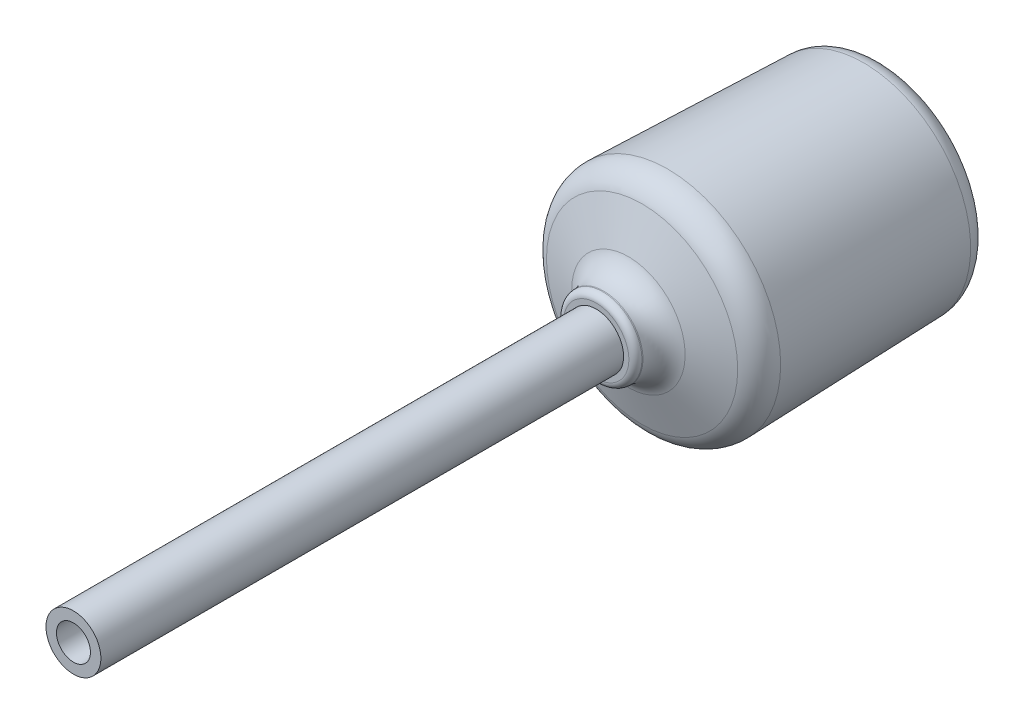
ISO-10303-21;
HEADER;
FILE_DESCRIPTION(('STEP AP214'),'2;1');
FILE_NAME('part.step','',(''),(''),'','','');
FILE_SCHEMA(('AUTOMOTIVE_DESIGN { 1 0 10303 214 1 1 1 1 }'));
ENDSEC;
DATA;
#1=APPLICATION_CONTEXT('core data for automotive mechanical design processes');
#2=APPLICATION_PROTOCOL_DEFINITION('international standard','automotive_design',2000,#1);
#3=PRODUCT_CONTEXT('',#1,'mechanical');
#4=PRODUCT('Part','Part','',(#3));
#5=PRODUCT_RELATED_PRODUCT_CATEGORY('part','',(#4));
#6=PRODUCT_DEFINITION_FORMATION('','',#4);
#7=PRODUCT_DEFINITION_CONTEXT('part definition',#1,'design');
#8=PRODUCT_DEFINITION('design','',#6,#7);
#9=PRODUCT_DEFINITION_SHAPE('','',#8);
#10=(LENGTH_UNIT() NAMED_UNIT(*) SI_UNIT(.MILLI.,.METRE.));
#11=(NAMED_UNIT(*) PLANE_ANGLE_UNIT() SI_UNIT($,.RADIAN.));
#12=(NAMED_UNIT(*) SI_UNIT($,.STERADIAN.) SOLID_ANGLE_UNIT());
#13=UNCERTAINTY_MEASURE_WITH_UNIT(LENGTH_MEASURE(1.E-05),#10,'distance_accuracy_value','');
#14=(GEOMETRIC_REPRESENTATION_CONTEXT(3) GLOBAL_UNCERTAINTY_ASSIGNED_CONTEXT((#13)) GLOBAL_UNIT_ASSIGNED_CONTEXT((#10,
#11,#12)) REPRESENTATION_CONTEXT('',''));
#15=CARTESIAN_POINT('',(0.,0.,0.));
#16=DIRECTION('',(0.,0.,1.));
#17=DIRECTION('',(1.,0.,0.));
#18=AXIS2_PLACEMENT_3D('',#15,#16,#17);
#19=CARTESIAN_POINT('',(0.,0.,-60.4292669602345));
#20=DIRECTION('',(0.,0.,1.));
#21=DIRECTION('',(1.,0.,0.));
#22=AXIS2_PLACEMENT_3D('',#19,#20,#21);
#23=TOROIDAL_SURFACE('',#22,6.68291096583191,1.49999999999997);
#24=CARTESIAN_POINT('',(0.,0.,-60.4763865090254));
#25=DIRECTION('',(0.,0.,1.));
#26=DIRECTION('',(1.,0.,0.));
#27=AXIS2_PLACEMENT_3D('',#24,#25,#26);
#28=CIRCLE('',#27,8.18217069920757);
#29=CARTESIAN_POINT('',(-8.18217069920757,0.,-60.4763865090254));
#30=VERTEX_POINT('',#29);
#31=EDGE_CURVE('E115',#30,#30,#28,.T.);
#32=ORIENTED_EDGE('',*,*,#31,.F.);
#33=CARTESIAN_POINT('',(-6.68291096583191,0.,-60.4292669602345));
#34=DIRECTION('',(0.,-1.,0.));
#35=DIRECTION('',(-1.,0.,0.));
#36=AXIS2_PLACEMENT_3D('',#33,#34,#35);
#37=CIRCLE('',#36,1.49999999999997);
#38=CARTESIAN_POINT('',(-7.15154004131193,0.,-61.8541833751918));
#39=VERTEX_POINT('',#38);
#40=EDGE_CURVE('E10',#30,#39,#37,.T.);
#41=ORIENTED_EDGE('',*,*,#40,.T.);
#42=CARTESIAN_POINT('',(0.,0.,-61.8541833751918));
#43=DIRECTION('',(0.,0.,1.));
#44=DIRECTION('',(1.,0.,0.));
#45=AXIS2_PLACEMENT_3D('',#42,#43,#44);
#46=CIRCLE('',#45,7.15154004131193);
#47=EDGE_CURVE('E129',#39,#39,#46,.T.);
#48=ORIENTED_EDGE('',*,*,#47,.T.);
#49=ORIENTED_EDGE('',*,*,#40,.F.);
#50=EDGE_LOOP('',(#32,#41,#48,#49));
#51=FACE_BOUND('',#50,.T.);
#52=ADVANCED_FACE('F15',(#51),#23,.T.);
#53=CARTESIAN_POINT('',(0.,0.,-40.1091672627132));
#54=DIRECTION('',(0.,0.,1.));
#55=DIRECTION('',(1.,0.,0.));
#56=AXIS2_PLACEMENT_3D('',#53,#54,#55);
#57=SPHERICAL_SURFACE('',#56,22.8908333333333);
#58=ORIENTED_EDGE('',*,*,#47,.F.);
#59=CARTESIAN_POINT('',(0.,0.,-40.1091672627132));
#60=DIRECTION('',(0.,-1.,0.));
#61=DIRECTION('',(-1.,0.,0.));
#62=AXIS2_PLACEMENT_3D('',#59,#60,#61);
#63=CIRCLE('',#62,22.8908333333333);
#64=CARTESIAN_POINT('',(0.,0.,-63.0000005960465));
#65=VERTEX_POINT('',#64);
#66=EDGE_CURVE('E26',#39,#65,#63,.T.);
#67=ORIENTED_EDGE('',*,*,#66,.T.);
#68=ORIENTED_EDGE('',*,*,#66,.F.);
#69=EDGE_LOOP('',(#58,#67,#68));
#70=FACE_BOUND('',#69,.T.);
#71=ADVANCED_FACE('F176',(#70),#57,.T.);
#72=CARTESIAN_POINT('',(0.,0.,-10.0000001490116));
#73=DIRECTION('',(0.,0.,1.));
#74=DIRECTION('',(1.,0.,0.));
#75=AXIS2_PLACEMENT_3D('',#72,#73,#74);
#76=PLANE('',#75);
#77=CARTESIAN_POINT('',(0.,0.,-10.0000001490116));
#78=DIRECTION('',(0.,0.,1.));
#79=DIRECTION('',(1.,0.,0.));
#80=AXIS2_PLACEMENT_3D('',#77,#78,#79);
#81=CIRCLE('',#80,1.3);
#82=CARTESIAN_POINT('',(-1.3,0.,-10.0000001490116));
#83=VERTEX_POINT('',#82);
#84=EDGE_CURVE('E144',#83,#83,#81,.T.);
#85=ORIENTED_EDGE('',*,*,#84,.T.);
#86=EDGE_LOOP('',(#85));
#87=FACE_BOUND('',#86,.T.);
#88=ADVANCED_FACE('F178',(#87),#76,.T.);
#89=CARTESIAN_POINT('',(0.,0.,-5.00000007450581));
#90=DIRECTION('',(0.,0.,1.));
#91=DIRECTION('',(1.,0.,0.));
#92=AXIS2_PLACEMENT_3D('',#89,#90,#91);
#93=CYLINDRICAL_SURFACE('',#92,1.3);
#94=CARTESIAN_POINT('',(0.,0.,0.));
#95=DIRECTION('',(0.,0.,1.));
#96=DIRECTION('',(1.,0.,0.));
#97=AXIS2_PLACEMENT_3D('',#94,#95,#96);
#98=CIRCLE('',#97,1.3);
#99=CARTESIAN_POINT('',(-1.3,0.,0.));
#100=VERTEX_POINT('',#99);
#101=EDGE_CURVE('E138',#100,#100,#98,.T.);
#102=ORIENTED_EDGE('',*,*,#101,.T.);
#103=DIRECTION('',(0.,0.,-1.));
#104=VECTOR('',#103,1.);
#105=CARTESIAN_POINT('',(-1.3,0.,-5.00000007450581));
#106=LINE('',#105,#104);
#107=EDGE_CURVE('E141',#100,#83,#106,.T.);
#108=ORIENTED_EDGE('',*,*,#107,.T.);
#109=ORIENTED_EDGE('',*,*,#84,.F.);
#110=ORIENTED_EDGE('',*,*,#107,.F.);
#111=EDGE_LOOP('',(#102,#108,#109,#110));
#112=FACE_BOUND('',#111,.T.);
#113=ADVANCED_FACE('F17',(#112),#93,.F.);
#114=CARTESIAN_POINT('',(1.3,0.,0.));
#115=DIRECTION('',(0.,0.,1.));
#116=DIRECTION('',(1.,0.,0.));
#117=AXIS2_PLACEMENT_3D('',#114,#115,#116);
#118=PLANE('',#117);
#119=ORIENTED_EDGE('',*,*,#101,.F.);
#120=EDGE_LOOP('',(#119));
#121=FACE_BOUND('',#120,.T.);
#122=CARTESIAN_POINT('',(0.,0.,0.));
#123=DIRECTION('',(0.,0.,1.));
#124=DIRECTION('',(1.,0.,0.));
#125=AXIS2_PLACEMENT_3D('',#122,#123,#124);
#126=CIRCLE('',#125,2.1);
#127=CARTESIAN_POINT('',(-2.1,0.,0.));
#128=VERTEX_POINT('',#127);
#129=EDGE_CURVE('E133',#128,#128,#126,.T.);
#130=ORIENTED_EDGE('',*,*,#129,.T.);
#131=EDGE_LOOP('',(#130));
#132=FACE_BOUND('',#131,.T.);
#133=ADVANCED_FACE('F188',(#121,#132),#118,.T.);
#134=CARTESIAN_POINT('',(0.,0.,-20.));
#135=DIRECTION('',(0.,0.,1.));
#136=DIRECTION('',(1.,0.,0.));
#137=AXIS2_PLACEMENT_3D('',#134,#135,#136);
#138=CYLINDRICAL_SURFACE('',#137,2.1);
#139=ORIENTED_EDGE('',*,*,#129,.F.);
#140=DIRECTION('',(0.,0.,-1.));
#141=VECTOR('',#140,1.);
#142=CARTESIAN_POINT('',(-2.1,0.,-20.));
#143=LINE('',#142,#141);
#144=CARTESIAN_POINT('',(-2.1,0.,-40.));
#145=VERTEX_POINT('',#144);
#146=EDGE_CURVE('E135',#128,#145,#143,.T.);
#147=ORIENTED_EDGE('',*,*,#146,.T.);
#148=CARTESIAN_POINT('',(0.,0.,-40.));
#149=DIRECTION('',(0.,0.,1.));
#150=DIRECTION('',(1.,0.,0.));
#151=AXIS2_PLACEMENT_3D('',#148,#149,#150);
#152=CIRCLE('',#151,2.1);
#153=EDGE_CURVE('E130',#145,#145,#152,.T.);
#154=ORIENTED_EDGE('',*,*,#153,.T.);
#155=ORIENTED_EDGE('',*,*,#146,.F.);
#156=EDGE_LOOP('',(#139,#147,#154,#155));
#157=FACE_BOUND('',#156,.T.);
#158=ADVANCED_FACE('F191',(#157),#138,.T.);
#159=CARTESIAN_POINT('',(2.1,0.,-40.));
#160=DIRECTION('',(0.,0.,1.));
#161=DIRECTION('',(1.,0.,0.));
#162=AXIS2_PLACEMENT_3D('',#159,#160,#161);
#163=PLANE('',#162);
#164=ORIENTED_EDGE('',*,*,#153,.F.);
#165=EDGE_LOOP('',(#164));
#166=FACE_BOUND('',#165,.T.);
#167=CARTESIAN_POINT('',(0.,0.,-40.0000002649095));
#168=DIRECTION('',(0.,0.,1.));
#169=DIRECTION('',(1.,0.,0.));
#170=AXIS2_PLACEMENT_3D('',#167,#168,#169);
#171=CIRCLE('',#170,2.50000000000011);
#172=CARTESIAN_POINT('',(-2.50000000000011,0.,-40.0000002649095));
#173=VERTEX_POINT('',#172);
#174=EDGE_CURVE('E161',#173,#173,#171,.T.);
#175=ORIENTED_EDGE('',*,*,#174,.T.);
#176=EDGE_LOOP('',(#175));
#177=FACE_BOUND('',#176,.T.);
#178=ADVANCED_FACE('F206',(#166,#177),#163,.T.);
#179=CARTESIAN_POINT('',(0.,0.,-40.5000002649094));
#180=DIRECTION('',(0.,0.,1.));
#181=DIRECTION('',(1.,0.,0.));
#182=AXIS2_PLACEMENT_3D('',#179,#180,#181);
#183=TOROIDAL_SURFACE('',#182,2.49999966886319,0.5);
#184=ORIENTED_EDGE('',*,*,#174,.F.);
#185=CARTESIAN_POINT('',(-2.49999966886319,0.,-40.5000002649094));
#186=DIRECTION('',(0.,-1.,0.));
#187=DIRECTION('',(-1.,0.,0.));
#188=AXIS2_PLACEMENT_3D('',#185,#186,#187);
#189=CIRCLE('',#188,0.5);
#190=CARTESIAN_POINT('',(-2.9999996416397,0.,-40.5000005960463));
#191=VERTEX_POINT('',#190);
#192=EDGE_CURVE('E78',#173,#191,#189,.T.);
#193=ORIENTED_EDGE('',*,*,#192,.T.);
#194=CARTESIAN_POINT('',(0.,0.,-40.5000005960463));
#195=DIRECTION('',(0.,0.,1.));
#196=DIRECTION('',(1.,0.,0.));
#197=AXIS2_PLACEMENT_3D('',#194,#195,#196);
#198=CIRCLE('',#197,2.99999966886308);
#199=EDGE_CURVE('E152',#191,#191,#198,.T.);
#200=ORIENTED_EDGE('',*,*,#199,.T.);
#201=ORIENTED_EDGE('',*,*,#192,.F.);
#202=EDGE_LOOP('',(#184,#193,#200,#201));
#203=FACE_BOUND('',#202,.T.);
#204=ADVANCED_FACE('F204',(#203),#183,.T.);
#205=CARTESIAN_POINT('',(0.,0.,-40.541106532843));
#206=DIRECTION('',(0.,0.,1.));
#207=DIRECTION('',(1.,0.,0.));
#208=AXIS2_PLACEMENT_3D('',#205,#206,#207);
#209=CYLINDRICAL_SURFACE('',#208,2.9999996416397);
#210=ORIENTED_EDGE('',*,*,#199,.F.);
#211=DIRECTION('',(0.,0.,-1.));
#212=VECTOR('',#211,1.);
#213=CARTESIAN_POINT('',(-2.9999996416397,0.,-40.541106532843));
#214=LINE('',#213,#212);
#215=CARTESIAN_POINT('',(-2.99999961441631,0.,-40.5822124696396));
#216=VERTEX_POINT('',#215);
#217=EDGE_CURVE('E68',#191,#216,#214,.T.);
#218=ORIENTED_EDGE('',*,*,#217,.T.);
#219=CARTESIAN_POINT('',(0.,0.,-40.5822124696396));
#220=DIRECTION('',(0.,0.,1.));
#221=DIRECTION('',(1.,0.,0.));
#222=AXIS2_PLACEMENT_3D('',#219,#220,#221);
#223=CIRCLE('',#222,2.99999961441631);
#224=EDGE_CURVE('E149',#216,#216,#223,.T.);
#225=ORIENTED_EDGE('',*,*,#224,.T.);
#226=ORIENTED_EDGE('',*,*,#217,.F.);
#227=EDGE_LOOP('',(#210,#218,#225,#226));
#228=FACE_BOUND('',#227,.T.);
#229=ADVANCED_FACE('F199',(#228),#209,.T.);
#230=CARTESIAN_POINT('',(0.,0.,-40.5822137941873));
#231=DIRECTION('',(0.,0.,1.));
#232=DIRECTION('',(1.,0.,0.));
#233=AXIS2_PLACEMENT_3D('',#230,#231,#232);
#234=TOROIDAL_SURFACE('',#233,4.99999961441586,2.);
#235=CARTESIAN_POINT('',(0.,0.,-42.4694131865099));
#236=DIRECTION('',(0.,0.,1.));
#237=DIRECTION('',(1.,0.,0.));
#238=AXIS2_PLACEMENT_3D('',#235,#236,#237);
#239=CIRCLE('',#238,4.33782255832198);
#240=CARTESIAN_POINT('',(-4.33782255832198,0.,-42.4694131865099));
#241=VERTEX_POINT('',#240);
#242=EDGE_CURVE('E109',#241,#241,#239,.T.);
#243=ORIENTED_EDGE('',*,*,#242,.T.);
#244=CARTESIAN_POINT('',(-4.99999961441586,0.,-40.5822137941873));
#245=DIRECTION('',(0.,-1.,0.));
#246=DIRECTION('',(-1.,0.,0.));
#247=AXIS2_PLACEMENT_3D('',#244,#245,#246);
#248=CIRCLE('',#247,2.);
#249=EDGE_CURVE('E153',#241,#216,#248,.T.);
#250=ORIENTED_EDGE('',*,*,#249,.T.);
#251=ORIENTED_EDGE('',*,*,#224,.F.);
#252=ORIENTED_EDGE('',*,*,#249,.F.);
#253=EDGE_LOOP('',(#243,#250,#251,#252));
#254=FACE_BOUND('',#253,.T.);
#255=ADVANCED_FACE('F196',(#254),#234,.F.);
#256=CARTESIAN_POINT('',(0.,0.,-42.9920995702659));
#257=DIRECTION('',(0.,0.,-1.));
#258=DIRECTION('',(1.,0.,0.));
#259=AXIS2_PLACEMENT_3D('',#256,#257,#258);
#260=CONICAL_SURFACE('',#259,5.82747463358177,1.2333393938346);
#261=ORIENTED_EDGE('',*,*,#242,.F.);
#262=DIRECTION('',(-0.943599696161305,0.,-0.331088528046944));
#263=VECTOR('',#262,1.);
#264=CARTESIAN_POINT('',(-5.82747463358177,0.,-42.9920995702659));
#265=LINE('',#264,#263);
#266=CARTESIAN_POINT('',(-7.31712670884156,0.,-43.5147859540219));
#267=VERTEX_POINT('',#266);
#268=EDGE_CURVE('E19',#241,#267,#265,.T.);
#269=ORIENTED_EDGE('',*,*,#268,.T.);
#270=CARTESIAN_POINT('',(0.,0.,-43.5147859540219));
#271=DIRECTION('',(0.,0.,1.));
#272=DIRECTION('',(1.,0.,0.));
#273=AXIS2_PLACEMENT_3D('',#270,#271,#272);
#274=CIRCLE('',#273,7.31712670884156);
#275=EDGE_CURVE('E107',#267,#267,#274,.T.);
#276=ORIENTED_EDGE('',*,*,#275,.T.);
#277=ORIENTED_EDGE('',*,*,#268,.F.);
#278=EDGE_LOOP('',(#261,#269,#276,#277));
#279=FACE_BOUND('',#278,.T.);
#280=ADVANCED_FACE('F195',(#279),#260,.T.);
#281=CARTESIAN_POINT('',(0.,0.,-45.4019853463446));
#282=DIRECTION('',(0.,0.,1.));
#283=DIRECTION('',(1.,0.,0.));
#284=AXIS2_PLACEMENT_3D('',#281,#282,#283);
#285=TOROIDAL_SURFACE('',#284,6.65494965274766,2.);
#286=ORIENTED_EDGE('',*,*,#275,.F.);
#287=CARTESIAN_POINT('',(-6.65494965274766,0.,-45.4019853463446));
#288=DIRECTION('',(0.,-1.,0.));
#289=DIRECTION('',(-1.,0.,0.));
#290=AXIS2_PLACEMENT_3D('',#287,#288,#289);
#291=CIRCLE('',#290,2.);
#292=CARTESIAN_POINT('',(-8.65396263058192,0.,-45.4648114113991));
#293=VERTEX_POINT('',#292);
#294=EDGE_CURVE('E101',#267,#293,#291,.T.);
#295=ORIENTED_EDGE('',*,*,#294,.T.);
#296=CARTESIAN_POINT('',(0.,0.,-45.4648114113991));
#297=DIRECTION('',(0.,0.,1.));
#298=DIRECTION('',(1.,0.,0.));
#299=AXIS2_PLACEMENT_3D('',#296,#297,#298);
#300=CIRCLE('',#299,8.65396263058192);
#301=EDGE_CURVE('E105',#293,#293,#300,.T.);
#302=ORIENTED_EDGE('',*,*,#301,.T.);
#303=ORIENTED_EDGE('',*,*,#294,.F.);
#304=EDGE_LOOP('',(#286,#295,#302,#303));
#305=FACE_BOUND('',#304,.T.);
#306=ADVANCED_FACE('F103',(#305),#285,.T.);
#307=CARTESIAN_POINT('',(0.,0.,-52.9705989602123));
#308=DIRECTION('',(0.,0.,1.));
#309=DIRECTION('',(1.,0.,0.));
#310=AXIS2_PLACEMENT_3D('',#307,#308,#309);
#311=CONICAL_SURFACE('',#310,8.41806666489475,0.031418201107491);
#312=ORIENTED_EDGE('',*,*,#301,.F.);
#313=DIRECTION('',(0.0314130325272772,0.,-0.999506488917126));
#314=VECTOR('',#313,1.);
#315=CARTESIAN_POINT('',(-8.41806666489475,0.,-52.9705989602123));
#316=LINE('',#315,#314);
#317=EDGE_CURVE('E113',#293,#30,#316,.T.);
#318=ORIENTED_EDGE('',*,*,#317,.T.);
#319=ORIENTED_EDGE('',*,*,#31,.T.);
#320=ORIENTED_EDGE('',*,*,#317,.F.);
#321=EDGE_LOOP('',(#312,#318,#319,#320));
#322=FACE_BOUND('',#321,.T.);
#323=ADVANCED_FACE('F114',(#322),#311,.T.);
#324=CLOSED_SHELL('',(#52,#71,#88,#113,#133,#158,#178,#204,#229,#255,#280,#306,#323));
#325=MANIFOLD_SOLID_BREP('B1',#324);
#326=ADVANCED_BREP_SHAPE_REPRESENTATION('',(#18,#325),#14);
#327=SHAPE_DEFINITION_REPRESENTATION(#9,#326);
ENDSEC;
END-ISO-10303-21;
